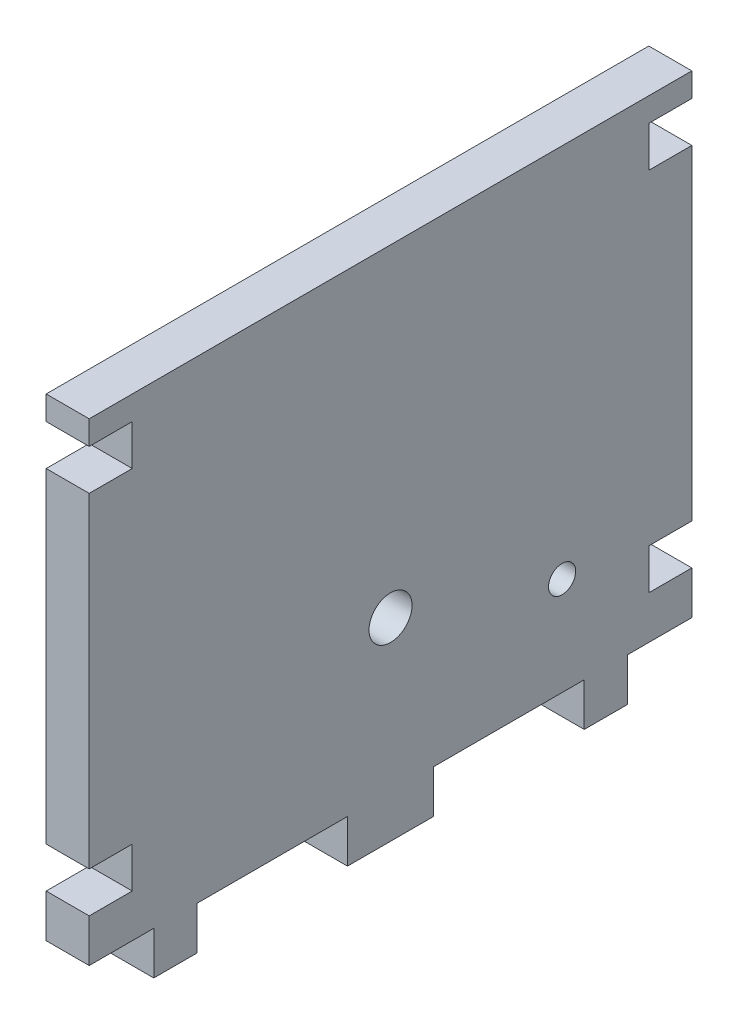
ISO-10303-21;
HEADER;
FILE_DESCRIPTION(('STEP AP214'),'2;1');
FILE_NAME('part.step','',(''),(''),'','','');
FILE_SCHEMA(('AUTOMOTIVE_DESIGN { 1 0 10303 214 1 1 1 1 }'));
ENDSEC;
DATA;
#1=APPLICATION_CONTEXT('core data for automotive mechanical design processes');
#2=APPLICATION_PROTOCOL_DEFINITION('international standard','automotive_design',2000,#1);
#3=PRODUCT_CONTEXT('',#1,'mechanical');
#4=PRODUCT('Part','Part','',(#3));
#5=PRODUCT_RELATED_PRODUCT_CATEGORY('part','',(#4));
#6=PRODUCT_DEFINITION_FORMATION('','',#4);
#7=PRODUCT_DEFINITION_CONTEXT('part definition',#1,'design');
#8=PRODUCT_DEFINITION('design','',#6,#7);
#9=PRODUCT_DEFINITION_SHAPE('','',#8);
#10=(LENGTH_UNIT() NAMED_UNIT(*) SI_UNIT(.MILLI.,.METRE.));
#11=(NAMED_UNIT(*) PLANE_ANGLE_UNIT() SI_UNIT($,.RADIAN.));
#12=(NAMED_UNIT(*) SI_UNIT($,.STERADIAN.) SOLID_ANGLE_UNIT());
#13=UNCERTAINTY_MEASURE_WITH_UNIT(LENGTH_MEASURE(1.E-05),#10,'distance_accuracy_value','');
#14=(GEOMETRIC_REPRESENTATION_CONTEXT(3) GLOBAL_UNCERTAINTY_ASSIGNED_CONTEXT((#13)) GLOBAL_UNIT_ASSIGNED_CONTEXT((#10,
#11,#12)) REPRESENTATION_CONTEXT('',''));
#15=CARTESIAN_POINT('',(0.,0.,0.));
#16=DIRECTION('',(0.,0.,1.));
#17=DIRECTION('',(1.,0.,0.));
#18=AXIS2_PLACEMENT_3D('',#15,#16,#17);
#19=CARTESIAN_POINT('',(6.35,0.,38.1));
#20=DIRECTION('',(0.,0.,-1.));
#21=DIRECTION('',(-1.,0.,0.));
#22=AXIS2_PLACEMENT_3D('',#19,#20,#21);
#23=PLANE('',#22);
#24=DIRECTION('',(0.,-1.,0.));
#25=VECTOR('',#24,1.);
#26=CARTESIAN_POINT('',(0.,0.,38.1));
#27=LINE('',#26,#25);
#28=CARTESIAN_POINT('',(0.,-9.88059999999999,38.1));
#29=VERTEX_POINT('',#28);
#30=CARTESIAN_POINT('',(0.,-15.875,38.1));
#31=VERTEX_POINT('',#30);
#32=EDGE_CURVE('E371',#29,#31,#27,.T.);
#33=ORIENTED_EDGE('',*,*,#32,.T.);
#34=DIRECTION('',(-1.,0.,0.));
#35=VECTOR('',#34,1.);
#36=CARTESIAN_POINT('',(6.35,-15.875,38.1));
#37=LINE('',#36,#35);
#38=CARTESIAN_POINT('',(6.35,-15.875,38.1));
#39=VERTEX_POINT('',#38);
#40=EDGE_CURVE('E11',#39,#31,#37,.T.);
#41=ORIENTED_EDGE('',*,*,#40,.F.);
#42=DIRECTION('',(0.,-1.,0.));
#43=VECTOR('',#42,1.);
#44=CARTESIAN_POINT('',(6.35,0.,38.1));
#45=LINE('',#44,#43);
#46=CARTESIAN_POINT('',(6.35,-9.88059999999999,38.1));
#47=VERTEX_POINT('',#46);
#48=EDGE_CURVE('E283',#47,#39,#45,.T.);
#49=ORIENTED_EDGE('',*,*,#48,.F.);
#50=DIRECTION('',(-1.,0.,0.));
#51=VECTOR('',#50,1.);
#52=CARTESIAN_POINT('',(6.35,-9.88059999999999,38.1));
#53=LINE('',#52,#51);
#54=EDGE_CURVE('E271',#47,#29,#53,.T.);
#55=ORIENTED_EDGE('',*,*,#54,.T.);
#56=EDGE_LOOP('',(#33,#41,#49,#55));
#57=FACE_BOUND('',#56,.T.);
#58=ADVANCED_FACE('F35',(#57),#23,.F.);
#59=CARTESIAN_POINT('',(6.35,-15.875,0.));
#60=DIRECTION('',(0.,-1.,0.));
#61=DIRECTION('',(0.,0.,-1.));
#62=AXIS2_PLACEMENT_3D('',#59,#60,#61);
#63=PLANE('',#62);
#64=DIRECTION('',(0.,0.,1.));
#65=VECTOR('',#64,1.);
#66=CARTESIAN_POINT('',(0.,-15.875,0.));
#67=LINE('',#66,#65);
#68=CARTESIAN_POINT('',(0.,-15.875,44.45));
#69=VERTEX_POINT('',#68);
#70=EDGE_CURVE('E365',#31,#69,#67,.T.);
#71=ORIENTED_EDGE('',*,*,#70,.T.);
#72=DIRECTION('',(-1.,0.,0.));
#73=VECTOR('',#72,1.);
#74=CARTESIAN_POINT('',(6.35,-15.875,44.45));
#75=LINE('',#74,#73);
#76=CARTESIAN_POINT('',(6.35,-15.875,44.45));
#77=VERTEX_POINT('',#76);
#78=EDGE_CURVE('E44',#77,#69,#75,.T.);
#79=ORIENTED_EDGE('',*,*,#78,.F.);
#80=DIRECTION('',(0.,0.,1.));
#81=VECTOR('',#80,1.);
#82=CARTESIAN_POINT('',(6.35,-15.875,0.));
#83=LINE('',#82,#81);
#84=EDGE_CURVE('E163',#39,#77,#83,.T.);
#85=ORIENTED_EDGE('',*,*,#84,.F.);
#86=ORIENTED_EDGE('',*,*,#40,.T.);
#87=EDGE_LOOP('',(#71,#79,#85,#86));
#88=FACE_BOUND('',#87,.T.);
#89=ADVANCED_FACE('F366',(#88),#63,.F.);
#90=CARTESIAN_POINT('',(6.35,0.,44.45));
#91=DIRECTION('',(0.,0.,1.));
#92=DIRECTION('',(1.,0.,0.));
#93=AXIS2_PLACEMENT_3D('',#90,#91,#92);
#94=PLANE('',#93);
#95=DIRECTION('',(0.,1.,0.));
#96=VECTOR('',#95,1.);
#97=CARTESIAN_POINT('',(0.,0.,44.45));
#98=LINE('',#97,#96);
#99=CARTESIAN_POINT('',(0.,-22.225,44.45));
#100=VERTEX_POINT('',#99);
#101=EDGE_CURVE('E296',#100,#69,#98,.T.);
#102=ORIENTED_EDGE('',*,*,#101,.F.);
#103=DIRECTION('',(-1.,0.,0.));
#104=VECTOR('',#103,1.);
#105=CARTESIAN_POINT('',(6.35,-22.225,44.45));
#106=LINE('',#105,#104);
#107=CARTESIAN_POINT('',(6.35,-22.225,44.45));
#108=VERTEX_POINT('',#107);
#109=EDGE_CURVE('E359',#108,#100,#106,.T.);
#110=ORIENTED_EDGE('',*,*,#109,.F.);
#111=DIRECTION('',(0.,1.,0.));
#112=VECTOR('',#111,1.);
#113=CARTESIAN_POINT('',(6.35,0.,44.45));
#114=LINE('',#113,#112);
#115=EDGE_CURVE('E270',#108,#77,#114,.T.);
#116=ORIENTED_EDGE('',*,*,#115,.T.);
#117=ORIENTED_EDGE('',*,*,#78,.T.);
#118=EDGE_LOOP('',(#102,#110,#116,#117));
#119=FACE_BOUND('',#118,.T.);
#120=ADVANCED_FACE('F362',(#119),#94,.T.);
#121=CARTESIAN_POINT('',(6.35,-22.225,0.));
#122=DIRECTION('',(0.,-1.,0.));
#123=DIRECTION('',(0.,0.,-1.));
#124=AXIS2_PLACEMENT_3D('',#121,#122,#123);
#125=PLANE('',#124);
#126=DIRECTION('',(0.,0.,1.));
#127=VECTOR('',#126,1.);
#128=CARTESIAN_POINT('',(0.,-22.225,0.));
#129=LINE('',#128,#127);
#130=CARTESIAN_POINT('',(0.,-22.225,34.925));
#131=VERTEX_POINT('',#130);
#132=EDGE_CURVE('E376',#131,#100,#129,.T.);
#133=ORIENTED_EDGE('',*,*,#132,.F.);
#134=DIRECTION('',(-1.,0.,0.));
#135=VECTOR('',#134,1.);
#136=CARTESIAN_POINT('',(6.35,-22.225,34.925));
#137=LINE('',#136,#135);
#138=CARTESIAN_POINT('',(6.35,-22.225,34.925));
#139=VERTEX_POINT('',#138);
#140=EDGE_CURVE('E357',#139,#131,#137,.T.);
#141=ORIENTED_EDGE('',*,*,#140,.F.);
#142=DIRECTION('',(0.,0.,1.));
#143=VECTOR('',#142,1.);
#144=CARTESIAN_POINT('',(6.35,-22.225,0.));
#145=LINE('',#144,#143);
#146=EDGE_CURVE('E276',#139,#108,#145,.T.);
#147=ORIENTED_EDGE('',*,*,#146,.T.);
#148=ORIENTED_EDGE('',*,*,#109,.T.);
#149=EDGE_LOOP('',(#133,#141,#147,#148));
#150=FACE_BOUND('',#149,.T.);
#151=ADVANCED_FACE('F561',(#150),#125,.T.);
#152=CARTESIAN_POINT('',(6.35,0.,34.925));
#153=DIRECTION('',(0.,0.,1.));
#154=DIRECTION('',(1.,0.,0.));
#155=AXIS2_PLACEMENT_3D('',#152,#153,#154);
#156=PLANE('',#155);
#157=DIRECTION('',(0.,1.,0.));
#158=VECTOR('',#157,1.);
#159=CARTESIAN_POINT('',(0.,0.,34.925));
#160=LINE('',#159,#158);
#161=CARTESIAN_POINT('',(0.,-28.575,34.925));
#162=VERTEX_POINT('',#161);
#163=EDGE_CURVE('E377',#162,#131,#160,.T.);
#164=ORIENTED_EDGE('',*,*,#163,.F.);
#165=DIRECTION('',(-1.,0.,0.));
#166=VECTOR('',#165,1.);
#167=CARTESIAN_POINT('',(6.35,-28.575,34.925));
#168=LINE('',#167,#166);
#169=CARTESIAN_POINT('',(6.35,-28.575,34.925));
#170=VERTEX_POINT('',#169);
#171=EDGE_CURVE('E355',#170,#162,#168,.T.);
#172=ORIENTED_EDGE('',*,*,#171,.F.);
#173=DIRECTION('',(0.,1.,0.));
#174=VECTOR('',#173,1.);
#175=CARTESIAN_POINT('',(6.35,0.,34.925));
#176=LINE('',#175,#174);
#177=EDGE_CURVE('E280',#170,#139,#176,.T.);
#178=ORIENTED_EDGE('',*,*,#177,.T.);
#179=ORIENTED_EDGE('',*,*,#140,.T.);
#180=EDGE_LOOP('',(#164,#172,#178,#179));
#181=FACE_BOUND('',#180,.T.);
#182=ADVANCED_FACE('F504',(#181),#156,.T.);
#183=CARTESIAN_POINT('',(6.35,-28.575,0.));
#184=DIRECTION('',(0.,-1.,0.));
#185=DIRECTION('',(0.,0.,-1.));
#186=AXIS2_PLACEMENT_3D('',#183,#184,#185);
#187=PLANE('',#186);
#188=DIRECTION('',(0.,0.,1.));
#189=VECTOR('',#188,1.);
#190=CARTESIAN_POINT('',(0.,-28.575,0.));
#191=LINE('',#190,#189);
#192=CARTESIAN_POINT('',(0.,-28.575,28.575));
#193=VERTEX_POINT('',#192);
#194=EDGE_CURVE('E384',#193,#162,#191,.T.);
#195=ORIENTED_EDGE('',*,*,#194,.F.);
#196=DIRECTION('',(-1.,0.,0.));
#197=VECTOR('',#196,1.);
#198=CARTESIAN_POINT('',(6.35,-28.575,28.575));
#199=LINE('',#198,#197);
#200=CARTESIAN_POINT('',(6.35,-28.575,28.575));
#201=VERTEX_POINT('',#200);
#202=EDGE_CURVE('E353',#201,#193,#199,.T.);
#203=ORIENTED_EDGE('',*,*,#202,.F.);
#204=DIRECTION('',(0.,0.,1.));
#205=VECTOR('',#204,1.);
#206=CARTESIAN_POINT('',(6.35,-28.575,0.));
#207=LINE('',#206,#205);
#208=EDGE_CURVE('E497',#201,#170,#207,.T.);
#209=ORIENTED_EDGE('',*,*,#208,.T.);
#210=ORIENTED_EDGE('',*,*,#171,.T.);
#211=EDGE_LOOP('',(#195,#203,#209,#210));
#212=FACE_BOUND('',#211,.T.);
#213=ADVANCED_FACE('F509',(#212),#187,.T.);
#214=CARTESIAN_POINT('',(6.35,0.,28.575));
#215=DIRECTION('',(0.,0.,1.));
#216=DIRECTION('',(0.,-1.,0.));
#217=AXIS2_PLACEMENT_3D('',#214,#215,#216);
#218=PLANE('',#217);
#219=DIRECTION('',(0.,1.,0.));
#220=VECTOR('',#219,1.);
#221=CARTESIAN_POINT('',(0.,0.,28.575));
#222=LINE('',#221,#220);
#223=CARTESIAN_POINT('',(0.,-22.225,28.575));
#224=VERTEX_POINT('',#223);
#225=EDGE_CURVE('E387',#193,#224,#222,.T.);
#226=ORIENTED_EDGE('',*,*,#225,.T.);
#227=DIRECTION('',(-1.,0.,0.));
#228=VECTOR('',#227,1.);
#229=CARTESIAN_POINT('',(6.35,-22.225,28.575));
#230=LINE('',#229,#228);
#231=CARTESIAN_POINT('',(6.35,-22.225,28.575));
#232=VERTEX_POINT('',#231);
#233=EDGE_CURVE('E351',#232,#224,#230,.T.);
#234=ORIENTED_EDGE('',*,*,#233,.F.);
#235=DIRECTION('',(0.,1.,0.));
#236=VECTOR('',#235,1.);
#237=CARTESIAN_POINT('',(6.35,0.,28.575));
#238=LINE('',#237,#236);
#239=EDGE_CURVE('E495',#201,#232,#238,.T.);
#240=ORIENTED_EDGE('',*,*,#239,.F.);
#241=ORIENTED_EDGE('',*,*,#202,.T.);
#242=EDGE_LOOP('',(#226,#234,#240,#241));
#243=FACE_BOUND('',#242,.T.);
#244=ADVANCED_FACE('F514',(#243),#218,.F.);
#245=CARTESIAN_POINT('',(0.,-22.225,6.34999999999999));
#246=VERTEX_POINT('',#245);
#247=EDGE_CURVE('E380',#246,#224,#129,.T.);
#248=ORIENTED_EDGE('',*,*,#247,.F.);
#249=DIRECTION('',(-1.,0.,0.));
#250=VECTOR('',#249,1.);
#251=CARTESIAN_POINT('',(6.35,-22.225,6.34999999999999));
#252=LINE('',#251,#250);
#253=CARTESIAN_POINT('',(6.35,-22.225,6.34999999999999));
#254=VERTEX_POINT('',#253);
#255=EDGE_CURVE('E349',#254,#246,#252,.T.);
#256=ORIENTED_EDGE('',*,*,#255,.F.);
#257=EDGE_CURVE('E282',#254,#232,#145,.T.);
#258=ORIENTED_EDGE('',*,*,#257,.T.);
#259=ORIENTED_EDGE('',*,*,#233,.T.);
#260=EDGE_LOOP('',(#248,#256,#258,#259));
#261=FACE_BOUND('',#260,.T.);
#262=ADVANCED_FACE('F558',(#261),#125,.T.);
#263=CARTESIAN_POINT('',(6.35,0.,6.34999999999999));
#264=DIRECTION('',(0.,0.,1.));
#265=DIRECTION('',(1.,0.,0.));
#266=AXIS2_PLACEMENT_3D('',#263,#264,#265);
#267=PLANE('',#266);
#268=DIRECTION('',(0.,1.,0.));
#269=VECTOR('',#268,1.);
#270=CARTESIAN_POINT('',(0.,0.,6.34999999999999));
#271=LINE('',#270,#269);
#272=CARTESIAN_POINT('',(0.,-28.575,6.34999999999999));
#273=VERTEX_POINT('',#272);
#274=EDGE_CURVE('E390',#273,#246,#271,.T.);
#275=ORIENTED_EDGE('',*,*,#274,.F.);
#276=DIRECTION('',(-1.,0.,0.));
#277=VECTOR('',#276,1.);
#278=CARTESIAN_POINT('',(6.35,-28.575,6.34999999999999));
#279=LINE('',#278,#277);
#280=CARTESIAN_POINT('',(6.35,-28.575,6.34999999999999));
#281=VERTEX_POINT('',#280);
#282=EDGE_CURVE('E347',#281,#273,#279,.T.);
#283=ORIENTED_EDGE('',*,*,#282,.F.);
#284=DIRECTION('',(0.,1.,0.));
#285=VECTOR('',#284,1.);
#286=CARTESIAN_POINT('',(6.35,0.,6.34999999999999));
#287=LINE('',#286,#285);
#288=EDGE_CURVE('E492',#281,#254,#287,.T.);
#289=ORIENTED_EDGE('',*,*,#288,.T.);
#290=ORIENTED_EDGE('',*,*,#255,.T.);
#291=EDGE_LOOP('',(#275,#283,#289,#290));
#292=FACE_BOUND('',#291,.T.);
#293=ADVANCED_FACE('F522',(#292),#267,.T.);
#294=CARTESIAN_POINT('',(6.35,-28.575,0.));
#295=DIRECTION('',(0.,-1.,0.));
#296=DIRECTION('',(0.,0.,-1.));
#297=AXIS2_PLACEMENT_3D('',#294,#295,#296);
#298=PLANE('',#297);
#299=DIRECTION('',(0.,0.,1.));
#300=VECTOR('',#299,1.);
#301=CARTESIAN_POINT('',(0.,-28.575,0.));
#302=LINE('',#301,#300);
#303=CARTESIAN_POINT('',(0.,-28.575,-6.35000000000001));
#304=VERTEX_POINT('',#303);
#305=EDGE_CURVE('E393',#304,#273,#302,.T.);
#306=ORIENTED_EDGE('',*,*,#305,.F.);
#307=DIRECTION('',(-1.,0.,0.));
#308=VECTOR('',#307,1.);
#309=CARTESIAN_POINT('',(6.35,-28.575,-6.35000000000001));
#310=LINE('',#309,#308);
#311=CARTESIAN_POINT('',(6.35,-28.575,-6.35000000000001));
#312=VERTEX_POINT('',#311);
#313=EDGE_CURVE('E345',#312,#304,#310,.T.);
#314=ORIENTED_EDGE('',*,*,#313,.F.);
#315=DIRECTION('',(0.,0.,1.));
#316=VECTOR('',#315,1.);
#317=CARTESIAN_POINT('',(6.35,-28.575,0.));
#318=LINE('',#317,#316);
#319=EDGE_CURVE('E489',#312,#281,#318,.T.);
#320=ORIENTED_EDGE('',*,*,#319,.T.);
#321=ORIENTED_EDGE('',*,*,#282,.T.);
#322=EDGE_LOOP('',(#306,#314,#320,#321));
#323=FACE_BOUND('',#322,.T.);
#324=ADVANCED_FACE('F526',(#323),#298,.T.);
#325=CARTESIAN_POINT('',(6.35,0.,-6.35000000000001));
#326=DIRECTION('',(0.,0.,1.));
#327=DIRECTION('',(1.,0.,0.));
#328=AXIS2_PLACEMENT_3D('',#325,#326,#327);
#329=PLANE('',#328);
#330=DIRECTION('',(0.,1.,0.));
#331=VECTOR('',#330,1.);
#332=CARTESIAN_POINT('',(0.,0.,-6.35000000000001));
#333=LINE('',#332,#331);
#334=CARTESIAN_POINT('',(0.,-22.225,-6.35000000000001));
#335=VERTEX_POINT('',#334);
#336=EDGE_CURVE('E396',#304,#335,#333,.T.);
#337=ORIENTED_EDGE('',*,*,#336,.T.);
#338=DIRECTION('',(-1.,0.,0.));
#339=VECTOR('',#338,1.);
#340=CARTESIAN_POINT('',(6.35,-22.225,-6.35000000000001));
#341=LINE('',#340,#339);
#342=CARTESIAN_POINT('',(6.35,-22.225,-6.35000000000001));
#343=VERTEX_POINT('',#342);
#344=EDGE_CURVE('E343',#343,#335,#341,.T.);
#345=ORIENTED_EDGE('',*,*,#344,.F.);
#346=DIRECTION('',(0.,1.,0.));
#347=VECTOR('',#346,1.);
#348=CARTESIAN_POINT('',(6.35,0.,-6.35000000000001));
#349=LINE('',#348,#347);
#350=EDGE_CURVE('E487',#312,#343,#349,.T.);
#351=ORIENTED_EDGE('',*,*,#350,.F.);
#352=ORIENTED_EDGE('',*,*,#313,.T.);
#353=EDGE_LOOP('',(#337,#345,#351,#352));
#354=FACE_BOUND('',#353,.T.);
#355=ADVANCED_FACE('F533',(#354),#329,.F.);
#356=CARTESIAN_POINT('',(0.,-22.225,-28.5749999999999));
#357=VERTEX_POINT('',#356);
#358=EDGE_CURVE('E399',#357,#335,#129,.T.);
#359=ORIENTED_EDGE('',*,*,#358,.F.);
#360=DIRECTION('',(-1.,0.,0.));
#361=VECTOR('',#360,1.);
#362=CARTESIAN_POINT('',(6.35,-22.225,-28.5749999999999));
#363=LINE('',#362,#361);
#364=CARTESIAN_POINT('',(6.35,-22.225,-28.5749999999999));
#365=VERTEX_POINT('',#364);
#366=EDGE_CURVE('E341',#365,#357,#363,.T.);
#367=ORIENTED_EDGE('',*,*,#366,.F.);
#368=EDGE_CURVE('E486',#365,#343,#145,.T.);
#369=ORIENTED_EDGE('',*,*,#368,.T.);
#370=ORIENTED_EDGE('',*,*,#344,.T.);
#371=EDGE_LOOP('',(#359,#367,#369,#370));
#372=FACE_BOUND('',#371,.T.);
#373=ADVANCED_FACE('F538',(#372),#125,.T.);
#374=CARTESIAN_POINT('',(6.35,0.,-28.5749999999999));
#375=DIRECTION('',(0.,0.,1.));
#376=DIRECTION('',(1.,0.,0.));
#377=AXIS2_PLACEMENT_3D('',#374,#375,#376);
#378=PLANE('',#377);
#379=DIRECTION('',(0.,1.,0.));
#380=VECTOR('',#379,1.);
#381=CARTESIAN_POINT('',(0.,0.,-28.5749999999999));
#382=LINE('',#381,#380);
#383=CARTESIAN_POINT('',(0.,-28.575,-28.5749999999999));
#384=VERTEX_POINT('',#383);
#385=EDGE_CURVE('E400',#384,#357,#382,.T.);
#386=ORIENTED_EDGE('',*,*,#385,.F.);
#387=DIRECTION('',(-1.,0.,0.));
#388=VECTOR('',#387,1.);
#389=CARTESIAN_POINT('',(6.35,-28.575,-28.5749999999999));
#390=LINE('',#389,#388);
#391=CARTESIAN_POINT('',(6.35,-28.575,-28.5749999999999));
#392=VERTEX_POINT('',#391);
#393=EDGE_CURVE('E339',#392,#384,#390,.T.);
#394=ORIENTED_EDGE('',*,*,#393,.F.);
#395=DIRECTION('',(0.,1.,0.));
#396=VECTOR('',#395,1.);
#397=CARTESIAN_POINT('',(6.35,0.,-28.5749999999999));
#398=LINE('',#397,#396);
#399=EDGE_CURVE('E483',#392,#365,#398,.T.);
#400=ORIENTED_EDGE('',*,*,#399,.T.);
#401=ORIENTED_EDGE('',*,*,#366,.T.);
#402=EDGE_LOOP('',(#386,#394,#400,#401));
#403=FACE_BOUND('',#402,.T.);
#404=ADVANCED_FACE('F571',(#403),#378,.T.);
#405=CARTESIAN_POINT('',(6.35,-28.575,0.));
#406=DIRECTION('',(0.,1.,0.));
#407=DIRECTION('',(0.,0.,1.));
#408=AXIS2_PLACEMENT_3D('',#405,#406,#407);
#409=PLANE('',#408);
#410=DIRECTION('',(0.,0.,-1.));
#411=VECTOR('',#410,1.);
#412=CARTESIAN_POINT('',(0.,-28.575,0.));
#413=LINE('',#412,#411);
#414=CARTESIAN_POINT('',(0.,-28.575,-34.925));
#415=VERTEX_POINT('',#414);
#416=EDGE_CURVE('E403',#384,#415,#413,.T.);
#417=ORIENTED_EDGE('',*,*,#416,.T.);
#418=DIRECTION('',(-1.,0.,0.));
#419=VECTOR('',#418,1.);
#420=CARTESIAN_POINT('',(6.35,-28.575,-34.925));
#421=LINE('',#420,#419);
#422=CARTESIAN_POINT('',(6.35,-28.575,-34.925));
#423=VERTEX_POINT('',#422);
#424=EDGE_CURVE('E336',#423,#415,#421,.T.);
#425=ORIENTED_EDGE('',*,*,#424,.F.);
#426=DIRECTION('',(0.,0.,-1.));
#427=VECTOR('',#426,1.);
#428=CARTESIAN_POINT('',(6.35,-28.575,0.));
#429=LINE('',#428,#427);
#430=EDGE_CURVE('E481',#392,#423,#429,.T.);
#431=ORIENTED_EDGE('',*,*,#430,.F.);
#432=ORIENTED_EDGE('',*,*,#393,.T.);
#433=EDGE_LOOP('',(#417,#425,#431,#432));
#434=FACE_BOUND('',#433,.T.);
#435=ADVANCED_FACE('F689',(#434),#409,.F.);
#436=CARTESIAN_POINT('',(6.35,0.,-34.925));
#437=DIRECTION('',(0.,0.,1.));
#438=DIRECTION('',(1.,0.,0.));
#439=AXIS2_PLACEMENT_3D('',#436,#437,#438);
#440=PLANE('',#439);
#441=DIRECTION('',(0.,1.,0.));
#442=VECTOR('',#441,1.);
#443=CARTESIAN_POINT('',(0.,0.,-34.925));
#444=LINE('',#443,#442);
#445=CARTESIAN_POINT('',(0.,-22.225,-34.925));
#446=VERTEX_POINT('',#445);
#447=EDGE_CURVE('E405',#415,#446,#444,.T.);
#448=ORIENTED_EDGE('',*,*,#447,.T.);
#449=DIRECTION('',(-1.,0.,0.));
#450=VECTOR('',#449,1.);
#451=CARTESIAN_POINT('',(6.35,-22.225,-34.925));
#452=LINE('',#451,#450);
#453=CARTESIAN_POINT('',(6.35,-22.225,-34.925));
#454=VERTEX_POINT('',#453);
#455=EDGE_CURVE('E334',#454,#446,#452,.T.);
#456=ORIENTED_EDGE('',*,*,#455,.F.);
#457=DIRECTION('',(0.,1.,0.));
#458=VECTOR('',#457,1.);
#459=CARTESIAN_POINT('',(6.35,0.,-34.925));
#460=LINE('',#459,#458);
#461=EDGE_CURVE('E479',#423,#454,#460,.T.);
#462=ORIENTED_EDGE('',*,*,#461,.F.);
#463=ORIENTED_EDGE('',*,*,#424,.T.);
#464=EDGE_LOOP('',(#448,#456,#462,#463));
#465=FACE_BOUND('',#464,.T.);
#466=ADVANCED_FACE('F552',(#465),#440,.F.);
#467=CARTESIAN_POINT('',(0.,-22.225,-44.45));
#468=VERTEX_POINT('',#467);
#469=EDGE_CURVE('E379',#468,#446,#129,.T.);
#470=ORIENTED_EDGE('',*,*,#469,.F.);
#471=DIRECTION('',(-1.,0.,0.));
#472=VECTOR('',#471,1.);
#473=CARTESIAN_POINT('',(6.35,-22.225,-44.45));
#474=LINE('',#473,#472);
#475=CARTESIAN_POINT('',(6.35,-22.225,-44.45));
#476=VERTEX_POINT('',#475);
#477=EDGE_CURVE('E332',#476,#468,#474,.T.);
#478=ORIENTED_EDGE('',*,*,#477,.F.);
#479=EDGE_CURVE('E281',#476,#454,#145,.T.);
#480=ORIENTED_EDGE('',*,*,#479,.T.);
#481=ORIENTED_EDGE('',*,*,#455,.T.);
#482=EDGE_LOOP('',(#470,#478,#480,#481));
#483=FACE_BOUND('',#482,.T.);
#484=ADVANCED_FACE('F543',(#483),#125,.T.);
#485=CARTESIAN_POINT('',(6.35,0.,-44.45));
#486=DIRECTION('',(0.,0.,1.));
#487=DIRECTION('',(1.,0.,0.));
#488=AXIS2_PLACEMENT_3D('',#485,#486,#487);
#489=PLANE('',#488);
#490=DIRECTION('',(0.,1.,0.));
#491=VECTOR('',#490,1.);
#492=CARTESIAN_POINT('',(0.,0.,-44.45));
#493=LINE('',#492,#491);
#494=CARTESIAN_POINT('',(0.,-15.875,-44.45));
#495=VERTEX_POINT('',#494);
#496=EDGE_CURVE('E408',#468,#495,#493,.T.);
#497=ORIENTED_EDGE('',*,*,#496,.T.);
#498=DIRECTION('',(-1.,0.,0.));
#499=VECTOR('',#498,1.);
#500=CARTESIAN_POINT('',(6.35,-15.875,-44.45));
#501=LINE('',#500,#499);
#502=CARTESIAN_POINT('',(6.35,-15.875,-44.45));
#503=VERTEX_POINT('',#502);
#504=EDGE_CURVE('E330',#503,#495,#501,.T.);
#505=ORIENTED_EDGE('',*,*,#504,.F.);
#506=DIRECTION('',(0.,1.,0.));
#507=VECTOR('',#506,1.);
#508=CARTESIAN_POINT('',(6.35,0.,-44.45));
#509=LINE('',#508,#507);
#510=EDGE_CURVE('E477',#476,#503,#509,.T.);
#511=ORIENTED_EDGE('',*,*,#510,.F.);
#512=ORIENTED_EDGE('',*,*,#477,.T.);
#513=EDGE_LOOP('',(#497,#505,#511,#512));
#514=FACE_BOUND('',#513,.T.);
#515=ADVANCED_FACE('F643',(#514),#489,.F.);
#516=CARTESIAN_POINT('',(6.35,-15.8750000000001,0.));
#517=DIRECTION('',(0.,1.,0.));
#518=DIRECTION('',(0.,0.,1.));
#519=AXIS2_PLACEMENT_3D('',#516,#517,#518);
#520=PLANE('',#519);
#521=DIRECTION('',(0.,0.,-1.));
#522=VECTOR('',#521,1.);
#523=CARTESIAN_POINT('',(0.,-15.8750000000001,0.));
#524=LINE('',#523,#522);
#525=CARTESIAN_POINT('',(0.,-15.875,-38.1));
#526=VERTEX_POINT('',#525);
#527=EDGE_CURVE('E411',#526,#495,#524,.T.);
#528=ORIENTED_EDGE('',*,*,#527,.F.);
#529=DIRECTION('',(-1.,0.,0.));
#530=VECTOR('',#529,1.);
#531=CARTESIAN_POINT('',(6.35,-15.875,-38.1));
#532=LINE('',#531,#530);
#533=CARTESIAN_POINT('',(6.35,-15.875,-38.1));
#534=VERTEX_POINT('',#533);
#535=EDGE_CURVE('E328',#534,#526,#532,.T.);
#536=ORIENTED_EDGE('',*,*,#535,.F.);
#537=DIRECTION('',(0.,0.,-1.));
#538=VECTOR('',#537,1.);
#539=CARTESIAN_POINT('',(6.35,-15.8750000000001,0.));
#540=LINE('',#539,#538);
#541=EDGE_CURVE('E474',#534,#503,#540,.T.);
#542=ORIENTED_EDGE('',*,*,#541,.T.);
#543=ORIENTED_EDGE('',*,*,#504,.T.);
#544=EDGE_LOOP('',(#528,#536,#542,#543));
#545=FACE_BOUND('',#544,.T.);
#546=ADVANCED_FACE('F649',(#545),#520,.T.);
#547=CARTESIAN_POINT('',(6.35,0.,-38.1));
#548=DIRECTION('',(0.,0.,1.));
#549=DIRECTION('',(1.,0.,0.));
#550=AXIS2_PLACEMENT_3D('',#547,#548,#549);
#551=PLANE('',#550);
#552=DIRECTION('',(0.,1.,0.));
#553=VECTOR('',#552,1.);
#554=CARTESIAN_POINT('',(0.,0.,-38.1));
#555=LINE('',#554,#553);
#556=CARTESIAN_POINT('',(0.,-9.88059999999999,-38.1));
#557=VERTEX_POINT('',#556);
#558=EDGE_CURVE('E415',#526,#557,#555,.T.);
#559=ORIENTED_EDGE('',*,*,#558,.T.);
#560=DIRECTION('',(-1.,0.,0.));
#561=VECTOR('',#560,1.);
#562=CARTESIAN_POINT('',(6.35,-9.88059999999999,-38.1));
#563=LINE('',#562,#561);
#564=CARTESIAN_POINT('',(6.35,-9.88059999999999,-38.1));
#565=VERTEX_POINT('',#564);
#566=EDGE_CURVE('E325',#565,#557,#563,.T.);
#567=ORIENTED_EDGE('',*,*,#566,.F.);
#568=DIRECTION('',(0.,1.,0.));
#569=VECTOR('',#568,1.);
#570=CARTESIAN_POINT('',(6.35,0.,-38.1));
#571=LINE('',#570,#569);
#572=EDGE_CURVE('E472',#534,#565,#571,.T.);
#573=ORIENTED_EDGE('',*,*,#572,.F.);
#574=ORIENTED_EDGE('',*,*,#535,.T.);
#575=EDGE_LOOP('',(#559,#567,#573,#574));
#576=FACE_BOUND('',#575,.T.);
#577=ADVANCED_FACE('F646',(#576),#551,.F.);
#578=CARTESIAN_POINT('',(6.35,-9.88059999999999,0.));
#579=DIRECTION('',(0.,1.,0.));
#580=DIRECTION('',(0.,0.,1.));
#581=AXIS2_PLACEMENT_3D('',#578,#579,#580);
#582=PLANE('',#581);
#583=DIRECTION('',(0.,0.,-1.));
#584=VECTOR('',#583,1.);
#585=CARTESIAN_POINT('',(0.,-9.88059999999999,0.));
#586=LINE('',#585,#584);
#587=CARTESIAN_POINT('',(0.,-9.88059999999999,-44.45));
#588=VERTEX_POINT('',#587);
#589=EDGE_CURVE('E417',#557,#588,#586,.T.);
#590=ORIENTED_EDGE('',*,*,#589,.T.);
#591=DIRECTION('',(-1.,0.,0.));
#592=VECTOR('',#591,1.);
#593=CARTESIAN_POINT('',(6.35,-9.88059999999999,-44.45));
#594=LINE('',#593,#592);
#595=CARTESIAN_POINT('',(6.35,-9.88059999999999,-44.45));
#596=VERTEX_POINT('',#595);
#597=EDGE_CURVE('E322',#596,#588,#594,.T.);
#598=ORIENTED_EDGE('',*,*,#597,.F.);
#599=DIRECTION('',(0.,0.,-1.));
#600=VECTOR('',#599,1.);
#601=CARTESIAN_POINT('',(6.35,-9.88059999999999,0.));
#602=LINE('',#601,#600);
#603=EDGE_CURVE('E470',#565,#596,#602,.T.);
#604=ORIENTED_EDGE('',*,*,#603,.F.);
#605=ORIENTED_EDGE('',*,*,#566,.T.);
#606=EDGE_LOOP('',(#590,#598,#604,#605));
#607=FACE_BOUND('',#606,.T.);
#608=ADVANCED_FACE('F641',(#607),#582,.F.);
#609=CARTESIAN_POINT('',(0.,38.1,-44.45));
#610=VERTEX_POINT('',#609);
#611=EDGE_CURVE('E412',#588,#610,#493,.T.);
#612=ORIENTED_EDGE('',*,*,#611,.T.);
#613=DIRECTION('',(-1.,0.,0.));
#614=VECTOR('',#613,1.);
#615=CARTESIAN_POINT('',(6.35,38.1,-44.45));
#616=LINE('',#615,#614);
#617=CARTESIAN_POINT('',(6.35,38.1,-44.45));
#618=VERTEX_POINT('',#617);
#619=EDGE_CURVE('E319',#618,#610,#616,.T.);
#620=ORIENTED_EDGE('',*,*,#619,.F.);
#621=EDGE_CURVE('E469',#596,#618,#509,.T.);
#622=ORIENTED_EDGE('',*,*,#621,.F.);
#623=ORIENTED_EDGE('',*,*,#597,.T.);
#624=EDGE_LOOP('',(#612,#620,#622,#623));
#625=FACE_BOUND('',#624,.T.);
#626=ADVANCED_FACE('F637',(#625),#489,.F.);
#627=CARTESIAN_POINT('',(6.35,38.0999999999999,0.));
#628=DIRECTION('',(0.,-1.,0.));
#629=DIRECTION('',(0.,0.,-1.));
#630=AXIS2_PLACEMENT_3D('',#627,#628,#629);
#631=PLANE('',#630);
#632=DIRECTION('',(0.,0.,1.));
#633=VECTOR('',#632,1.);
#634=CARTESIAN_POINT('',(0.,38.0999999999999,0.));
#635=LINE('',#634,#633);
#636=CARTESIAN_POINT('',(0.,38.1,-38.1));
#637=VERTEX_POINT('',#636);
#638=EDGE_CURVE('E419',#610,#637,#635,.T.);
#639=ORIENTED_EDGE('',*,*,#638,.T.);
#640=DIRECTION('',(-1.,0.,0.));
#641=VECTOR('',#640,1.);
#642=CARTESIAN_POINT('',(6.35,38.1,-38.1));
#643=LINE('',#642,#641);
#644=CARTESIAN_POINT('',(6.35,38.1,-38.1));
#645=VERTEX_POINT('',#644);
#646=EDGE_CURVE('E317',#645,#637,#643,.T.);
#647=ORIENTED_EDGE('',*,*,#646,.F.);
#648=DIRECTION('',(0.,0.,1.));
#649=VECTOR('',#648,1.);
#650=CARTESIAN_POINT('',(6.35,38.0999999999999,0.));
#651=LINE('',#650,#649);
#652=EDGE_CURVE('E467',#618,#645,#651,.T.);
#653=ORIENTED_EDGE('',*,*,#652,.F.);
#654=ORIENTED_EDGE('',*,*,#619,.T.);
#655=EDGE_LOOP('',(#639,#647,#653,#654));
#656=FACE_BOUND('',#655,.T.);
#657=ADVANCED_FACE('F633',(#656),#631,.F.);
#658=CARTESIAN_POINT('',(6.35,0.,-38.1));
#659=DIRECTION('',(0.,0.,-1.));
#660=DIRECTION('',(-1.,0.,0.));
#661=AXIS2_PLACEMENT_3D('',#658,#659,#660);
#662=PLANE('',#661);
#663=DIRECTION('',(0.,-1.,0.));
#664=VECTOR('',#663,1.);
#665=CARTESIAN_POINT('',(0.,0.,-38.1));
#666=LINE('',#665,#664);
#667=CARTESIAN_POINT('',(0.,44.0944,-38.1));
#668=VERTEX_POINT('',#667);
#669=EDGE_CURVE('E422',#668,#637,#666,.T.);
#670=ORIENTED_EDGE('',*,*,#669,.F.);
#671=DIRECTION('',(-1.,0.,0.));
#672=VECTOR('',#671,1.);
#673=CARTESIAN_POINT('',(6.35,44.0944,-38.1));
#674=LINE('',#673,#672);
#675=CARTESIAN_POINT('',(6.35,44.0944,-38.1));
#676=VERTEX_POINT('',#675);
#677=EDGE_CURVE('E315',#676,#668,#674,.T.);
#678=ORIENTED_EDGE('',*,*,#677,.F.);
#679=DIRECTION('',(0.,-1.,0.));
#680=VECTOR('',#679,1.);
#681=CARTESIAN_POINT('',(6.35,0.,-38.1));
#682=LINE('',#681,#680);
#683=EDGE_CURVE('E464',#676,#645,#682,.T.);
#684=ORIENTED_EDGE('',*,*,#683,.T.);
#685=ORIENTED_EDGE('',*,*,#646,.T.);
#686=EDGE_LOOP('',(#670,#678,#684,#685));
#687=FACE_BOUND('',#686,.T.);
#688=ADVANCED_FACE('F629',(#687),#662,.T.);
#689=CARTESIAN_POINT('',(6.35,44.0944,0.));
#690=DIRECTION('',(0.,-1.,0.));
#691=DIRECTION('',(0.,0.,-1.));
#692=AXIS2_PLACEMENT_3D('',#689,#690,#691);
#693=PLANE('',#692);
#694=DIRECTION('',(0.,0.,1.));
#695=VECTOR('',#694,1.);
#696=CARTESIAN_POINT('',(0.,44.0944,0.));
#697=LINE('',#696,#695);
#698=CARTESIAN_POINT('',(0.,44.0944,-44.45));
#699=VERTEX_POINT('',#698);
#700=EDGE_CURVE('E425',#699,#668,#697,.T.);
#701=ORIENTED_EDGE('',*,*,#700,.F.);
#702=DIRECTION('',(-1.,0.,0.));
#703=VECTOR('',#702,1.);
#704=CARTESIAN_POINT('',(6.35,44.0944,-44.45));
#705=LINE('',#704,#703);
#706=CARTESIAN_POINT('',(6.35,44.0944,-44.45));
#707=VERTEX_POINT('',#706);
#708=EDGE_CURVE('E313',#707,#699,#705,.T.);
#709=ORIENTED_EDGE('',*,*,#708,.F.);
#710=DIRECTION('',(0.,0.,1.));
#711=VECTOR('',#710,1.);
#712=CARTESIAN_POINT('',(6.35,44.0944,0.));
#713=LINE('',#712,#711);
#714=EDGE_CURVE('E461',#707,#676,#713,.T.);
#715=ORIENTED_EDGE('',*,*,#714,.T.);
#716=ORIENTED_EDGE('',*,*,#677,.T.);
#717=EDGE_LOOP('',(#701,#709,#715,#716));
#718=FACE_BOUND('',#717,.T.);
#719=ADVANCED_FACE('F625',(#718),#693,.T.);
#720=CARTESIAN_POINT('',(6.35,0.,-44.45));
#721=DIRECTION('',(0.,0.,-1.));
#722=DIRECTION('',(0.,1.,0.));
#723=AXIS2_PLACEMENT_3D('',#720,#721,#722);
#724=PLANE('',#723);
#725=DIRECTION('',(0.,-1.,0.));
#726=VECTOR('',#725,1.);
#727=CARTESIAN_POINT('',(0.,0.,-44.45));
#728=LINE('',#727,#726);
#729=CARTESIAN_POINT('',(0.,47.625,-44.45));
#730=VERTEX_POINT('',#729);
#731=EDGE_CURVE('E428',#730,#699,#728,.T.);
#732=ORIENTED_EDGE('',*,*,#731,.F.);
#733=DIRECTION('',(-1.,0.,0.));
#734=VECTOR('',#733,1.);
#735=CARTESIAN_POINT('',(6.35,47.625,-44.45));
#736=LINE('',#735,#734);
#737=CARTESIAN_POINT('',(6.35,47.625,-44.45));
#738=VERTEX_POINT('',#737);
#739=EDGE_CURVE('E311',#738,#730,#736,.T.);
#740=ORIENTED_EDGE('',*,*,#739,.F.);
#741=DIRECTION('',(0.,-1.,0.));
#742=VECTOR('',#741,1.);
#743=CARTESIAN_POINT('',(6.35,0.,-44.45));
#744=LINE('',#743,#742);
#745=EDGE_CURVE('E458',#738,#707,#744,.T.);
#746=ORIENTED_EDGE('',*,*,#745,.T.);
#747=ORIENTED_EDGE('',*,*,#708,.T.);
#748=EDGE_LOOP('',(#732,#740,#746,#747));
#749=FACE_BOUND('',#748,.T.);
#750=ADVANCED_FACE('F621',(#749),#724,.T.);
#751=CARTESIAN_POINT('',(6.35,47.625,0.));
#752=DIRECTION('',(0.,1.,0.));
#753=DIRECTION('',(0.,0.,1.));
#754=AXIS2_PLACEMENT_3D('',#751,#752,#753);
#755=PLANE('',#754);
#756=DIRECTION('',(0.,0.,-1.));
#757=VECTOR('',#756,1.);
#758=CARTESIAN_POINT('',(0.,47.625,0.));
#759=LINE('',#758,#757);
#760=CARTESIAN_POINT('',(0.,47.625,44.45));
#761=VERTEX_POINT('',#760);
#762=EDGE_CURVE('E431',#761,#730,#759,.T.);
#763=ORIENTED_EDGE('',*,*,#762,.F.);
#764=DIRECTION('',(-1.,0.,0.));
#765=VECTOR('',#764,1.);
#766=CARTESIAN_POINT('',(6.35,47.625,44.45));
#767=LINE('',#766,#765);
#768=CARTESIAN_POINT('',(6.35,47.625,44.45));
#769=VERTEX_POINT('',#768);
#770=EDGE_CURVE('E309',#769,#761,#767,.T.);
#771=ORIENTED_EDGE('',*,*,#770,.F.);
#772=DIRECTION('',(0.,0.,-1.));
#773=VECTOR('',#772,1.);
#774=CARTESIAN_POINT('',(6.35,47.625,0.));
#775=LINE('',#774,#773);
#776=EDGE_CURVE('E455',#769,#738,#775,.T.);
#777=ORIENTED_EDGE('',*,*,#776,.T.);
#778=ORIENTED_EDGE('',*,*,#739,.T.);
#779=EDGE_LOOP('',(#763,#771,#777,#778));
#780=FACE_BOUND('',#779,.T.);
#781=ADVANCED_FACE('F617',(#780),#755,.T.);
#782=CARTESIAN_POINT('',(6.35,0.,44.45));
#783=DIRECTION('',(0.,0.,-1.));
#784=DIRECTION('',(-1.,0.,0.));
#785=AXIS2_PLACEMENT_3D('',#782,#783,#784);
#786=PLANE('',#785);
#787=DIRECTION('',(0.,-1.,0.));
#788=VECTOR('',#787,1.);
#789=CARTESIAN_POINT('',(0.,0.,44.45));
#790=LINE('',#789,#788);
#791=CARTESIAN_POINT('',(0.,44.0944,44.45));
#792=VERTEX_POINT('',#791);
#793=EDGE_CURVE('E434',#761,#792,#790,.T.);
#794=ORIENTED_EDGE('',*,*,#793,.T.);
#795=DIRECTION('',(-1.,0.,0.));
#796=VECTOR('',#795,1.);
#797=CARTESIAN_POINT('',(6.35,44.0944,44.45));
#798=LINE('',#797,#796);
#799=CARTESIAN_POINT('',(6.35,44.0944,44.45));
#800=VERTEX_POINT('',#799);
#801=EDGE_CURVE('E306',#800,#792,#798,.T.);
#802=ORIENTED_EDGE('',*,*,#801,.F.);
#803=DIRECTION('',(0.,-1.,0.));
#804=VECTOR('',#803,1.);
#805=CARTESIAN_POINT('',(6.35,0.,44.45));
#806=LINE('',#805,#804);
#807=EDGE_CURVE('E453',#769,#800,#806,.T.);
#808=ORIENTED_EDGE('',*,*,#807,.F.);
#809=ORIENTED_EDGE('',*,*,#770,.T.);
#810=EDGE_LOOP('',(#794,#802,#808,#809));
#811=FACE_BOUND('',#810,.T.);
#812=ADVANCED_FACE('F613',(#811),#786,.F.);
#813=CARTESIAN_POINT('',(6.35,44.0944,0.));
#814=DIRECTION('',(0.,1.,0.));
#815=DIRECTION('',(0.,0.,1.));
#816=AXIS2_PLACEMENT_3D('',#813,#814,#815);
#817=PLANE('',#816);
#818=DIRECTION('',(0.,0.,-1.));
#819=VECTOR('',#818,1.);
#820=CARTESIAN_POINT('',(0.,44.0944,0.));
#821=LINE('',#820,#819);
#822=CARTESIAN_POINT('',(0.,44.0944,38.1));
#823=VERTEX_POINT('',#822);
#824=EDGE_CURVE('E436',#792,#823,#821,.T.);
#825=ORIENTED_EDGE('',*,*,#824,.T.);
#826=DIRECTION('',(-1.,0.,0.));
#827=VECTOR('',#826,1.);
#828=CARTESIAN_POINT('',(6.35,44.0944,38.1));
#829=LINE('',#828,#827);
#830=CARTESIAN_POINT('',(6.35,44.0944,38.1));
#831=VERTEX_POINT('',#830);
#832=EDGE_CURVE('E303',#831,#823,#829,.T.);
#833=ORIENTED_EDGE('',*,*,#832,.F.);
#834=DIRECTION('',(0.,0.,-1.));
#835=VECTOR('',#834,1.);
#836=CARTESIAN_POINT('',(6.35,44.0944,0.));
#837=LINE('',#836,#835);
#838=EDGE_CURVE('E451',#800,#831,#837,.T.);
#839=ORIENTED_EDGE('',*,*,#838,.F.);
#840=ORIENTED_EDGE('',*,*,#801,.T.);
#841=EDGE_LOOP('',(#825,#833,#839,#840));
#842=FACE_BOUND('',#841,.T.);
#843=ADVANCED_FACE('F610',(#842),#817,.F.);
#844=CARTESIAN_POINT('',(6.35,0.,38.1));
#845=DIRECTION('',(0.,0.,-1.));
#846=DIRECTION('',(-1.,0.,0.));
#847=AXIS2_PLACEMENT_3D('',#844,#845,#846);
#848=PLANE('',#847);
#849=DIRECTION('',(0.,-1.,0.));
#850=VECTOR('',#849,1.);
#851=CARTESIAN_POINT('',(0.,0.,38.1));
#852=LINE('',#851,#850);
#853=CARTESIAN_POINT('',(0.,38.1,38.1));
#854=VERTEX_POINT('',#853);
#855=EDGE_CURVE('E437',#823,#854,#852,.T.);
#856=ORIENTED_EDGE('',*,*,#855,.T.);
#857=DIRECTION('',(-1.,0.,0.));
#858=VECTOR('',#857,1.);
#859=CARTESIAN_POINT('',(6.35,38.1,38.1));
#860=LINE('',#859,#858);
#861=CARTESIAN_POINT('',(6.35,38.1,38.1));
#862=VERTEX_POINT('',#861);
#863=EDGE_CURVE('E260',#862,#854,#860,.T.);
#864=ORIENTED_EDGE('',*,*,#863,.F.);
#865=DIRECTION('',(0.,-1.,0.));
#866=VECTOR('',#865,1.);
#867=CARTESIAN_POINT('',(6.35,0.,38.1));
#868=LINE('',#867,#866);
#869=EDGE_CURVE('E265',#831,#862,#868,.T.);
#870=ORIENTED_EDGE('',*,*,#869,.F.);
#871=ORIENTED_EDGE('',*,*,#832,.T.);
#872=EDGE_LOOP('',(#856,#864,#870,#871));
#873=FACE_BOUND('',#872,.T.);
#874=ADVANCED_FACE('F607',(#873),#848,.F.);
#875=CARTESIAN_POINT('',(6.35,38.1,0.));
#876=DIRECTION('',(0.,1.,0.));
#877=DIRECTION('',(0.,0.,1.));
#878=AXIS2_PLACEMENT_3D('',#875,#876,#877);
#879=PLANE('',#878);
#880=DIRECTION('',(0.,0.,-1.));
#881=VECTOR('',#880,1.);
#882=CARTESIAN_POINT('',(0.,38.1,0.));
#883=LINE('',#882,#881);
#884=CARTESIAN_POINT('',(0.,38.1,44.45));
#885=VERTEX_POINT('',#884);
#886=EDGE_CURVE('E255',#885,#854,#883,.T.);
#887=ORIENTED_EDGE('',*,*,#886,.F.);
#888=DIRECTION('',(-1.,0.,0.));
#889=VECTOR('',#888,1.);
#890=CARTESIAN_POINT('',(6.35,38.1,44.45));
#891=LINE('',#890,#889);
#892=CARTESIAN_POINT('',(6.35,38.1,44.45));
#893=VERTEX_POINT('',#892);
#894=EDGE_CURVE('E250',#893,#885,#891,.T.);
#895=ORIENTED_EDGE('',*,*,#894,.F.);
#896=DIRECTION('',(0.,0.,-1.));
#897=VECTOR('',#896,1.);
#898=CARTESIAN_POINT('',(6.35,38.1,0.));
#899=LINE('',#898,#897);
#900=EDGE_CURVE('E253',#893,#862,#899,.T.);
#901=ORIENTED_EDGE('',*,*,#900,.T.);
#902=ORIENTED_EDGE('',*,*,#863,.T.);
#903=EDGE_LOOP('',(#887,#895,#901,#902));
#904=FACE_BOUND('',#903,.T.);
#905=ADVANCED_FACE('F252',(#904),#879,.T.);
#906=CARTESIAN_POINT('',(0.,-9.88059999999999,44.45));
#907=VERTEX_POINT('',#906);
#908=EDGE_CURVE('E293',#907,#885,#98,.T.);
#909=ORIENTED_EDGE('',*,*,#908,.F.);
#910=DIRECTION('',(-1.,0.,0.));
#911=VECTOR('',#910,1.);
#912=CARTESIAN_POINT('',(6.35,-9.88059999999999,44.45));
#913=LINE('',#912,#911);
#914=CARTESIAN_POINT('',(6.35,-9.88059999999999,44.45));
#915=VERTEX_POINT('',#914);
#916=EDGE_CURVE('E152',#915,#907,#913,.T.);
#917=ORIENTED_EDGE('',*,*,#916,.F.);
#918=EDGE_CURVE('E263',#915,#893,#114,.T.);
#919=ORIENTED_EDGE('',*,*,#918,.T.);
#920=ORIENTED_EDGE('',*,*,#894,.T.);
#921=EDGE_LOOP('',(#909,#917,#919,#920));
#922=FACE_BOUND('',#921,.T.);
#923=ADVANCED_FACE('F268',(#922),#94,.T.);
#924=CARTESIAN_POINT('',(6.35,0.,0.));
#925=DIRECTION('',(-1.,0.,0.));
#926=DIRECTION('',(0.,0.,1.));
#927=AXIS2_PLACEMENT_3D('',#924,#925,#926);
#928=CYLINDRICAL_SURFACE('',#927,3.175);
#929=CARTESIAN_POINT('',(6.35,0.,0.));
#930=DIRECTION('',(1.,0.,0.));
#931=DIRECTION('',(0.,0.,-1.));
#932=AXIS2_PLACEMENT_3D('',#929,#930,#931);
#933=CIRCLE('',#932,3.175);
#934=CARTESIAN_POINT('',(6.35,0.,-3.175));
#935=VERTEX_POINT('',#934);
#936=EDGE_CURVE('E284',#935,#935,#933,.T.);
#937=ORIENTED_EDGE('',*,*,#936,.T.);
#938=EDGE_LOOP('',(#937));
#939=FACE_BOUND('',#938,.T.);
#940=CARTESIAN_POINT('',(0.,0.,0.));
#941=DIRECTION('',(1.,0.,0.));
#942=DIRECTION('',(0.,0.,-1.));
#943=AXIS2_PLACEMENT_3D('',#940,#941,#942);
#944=CIRCLE('',#943,3.175);
#945=CARTESIAN_POINT('',(0.,0.,-3.175));
#946=VERTEX_POINT('',#945);
#947=EDGE_CURVE('E443',#946,#946,#944,.T.);
#948=ORIENTED_EDGE('',*,*,#947,.F.);
#949=EDGE_LOOP('',(#948));
#950=FACE_BOUND('',#949,.T.);
#951=ADVANCED_FACE('F581',(#939,#950),#928,.F.);
#952=CARTESIAN_POINT('',(6.35,-7.724902,-25.309068));
#953=DIRECTION('',(-1.,0.,0.));
#954=DIRECTION('',(0.,0.,1.));
#955=AXIS2_PLACEMENT_3D('',#952,#953,#954);
#956=CYLINDRICAL_SURFACE('',#955,2.);
#957=CARTESIAN_POINT('',(6.35,-7.724902,-25.309068));
#958=DIRECTION('',(1.,0.,0.));
#959=DIRECTION('',(0.,0.,-1.));
#960=AXIS2_PLACEMENT_3D('',#957,#958,#959);
#961=CIRCLE('',#960,2.);
#962=CARTESIAN_POINT('',(6.35,-7.724902,-27.309068));
#963=VERTEX_POINT('',#962);
#964=EDGE_CURVE('E289',#963,#963,#961,.T.);
#965=ORIENTED_EDGE('',*,*,#964,.T.);
#966=EDGE_LOOP('',(#965));
#967=FACE_BOUND('',#966,.T.);
#968=CARTESIAN_POINT('',(0.,-7.724902,-25.309068));
#969=DIRECTION('',(1.,0.,0.));
#970=DIRECTION('',(0.,0.,-1.));
#971=AXIS2_PLACEMENT_3D('',#968,#969,#970);
#972=CIRCLE('',#971,2.);
#973=CARTESIAN_POINT('',(0.,-7.724902,-27.309068));
#974=VERTEX_POINT('',#973);
#975=EDGE_CURVE('E445',#974,#974,#972,.T.);
#976=ORIENTED_EDGE('',*,*,#975,.F.);
#977=EDGE_LOOP('',(#976));
#978=FACE_BOUND('',#977,.T.);
#979=ADVANCED_FACE('F37',(#967,#978),#956,.F.);
#980=CARTESIAN_POINT('',(6.35,-9.88059999999999,0.));
#981=DIRECTION('',(0.,1.,0.));
#982=DIRECTION('',(0.,0.,1.));
#983=AXIS2_PLACEMENT_3D('',#980,#981,#982);
#984=PLANE('',#983);
#985=DIRECTION('',(0.,0.,-1.));
#986=VECTOR('',#985,1.);
#987=CARTESIAN_POINT('',(0.,-9.88059999999999,0.));
#988=LINE('',#987,#986);
#989=EDGE_CURVE('E155',#907,#29,#988,.T.);
#990=ORIENTED_EDGE('',*,*,#989,.T.);
#991=ORIENTED_EDGE('',*,*,#54,.F.);
#992=DIRECTION('',(0.,0.,-1.));
#993=VECTOR('',#992,1.);
#994=CARTESIAN_POINT('',(6.35,-9.88059999999999,0.));
#995=LINE('',#994,#993);
#996=EDGE_CURVE('E52',#915,#47,#995,.T.);
#997=ORIENTED_EDGE('',*,*,#996,.F.);
#998=ORIENTED_EDGE('',*,*,#916,.T.);
#999=EDGE_LOOP('',(#990,#991,#997,#998));
#1000=FACE_BOUND('',#999,.T.);
#1001=ADVANCED_FACE('F588',(#1000),#984,.F.);
#1002=CARTESIAN_POINT('',(6.35,0.,0.));
#1003=DIRECTION('',(1.,0.,0.));
#1004=DIRECTION('',(0.,0.,-1.));
#1005=AXIS2_PLACEMENT_3D('',#1002,#1003,#1004);
#1006=PLANE('',#1005);
#1007=ORIENTED_EDGE('',*,*,#964,.F.);
#1008=EDGE_LOOP('',(#1007));
#1009=FACE_BOUND('',#1008,.T.);
#1010=ORIENTED_EDGE('',*,*,#936,.F.);
#1011=EDGE_LOOP('',(#1010));
#1012=FACE_BOUND('',#1011,.T.);
#1013=ORIENTED_EDGE('',*,*,#48,.T.);
#1014=ORIENTED_EDGE('',*,*,#84,.T.);
#1015=ORIENTED_EDGE('',*,*,#115,.F.);
#1016=ORIENTED_EDGE('',*,*,#146,.F.);
#1017=ORIENTED_EDGE('',*,*,#177,.F.);
#1018=ORIENTED_EDGE('',*,*,#208,.F.);
#1019=ORIENTED_EDGE('',*,*,#239,.T.);
#1020=ORIENTED_EDGE('',*,*,#257,.F.);
#1021=ORIENTED_EDGE('',*,*,#288,.F.);
#1022=ORIENTED_EDGE('',*,*,#319,.F.);
#1023=ORIENTED_EDGE('',*,*,#350,.T.);
#1024=ORIENTED_EDGE('',*,*,#368,.F.);
#1025=ORIENTED_EDGE('',*,*,#399,.F.);
#1026=ORIENTED_EDGE('',*,*,#430,.T.);
#1027=ORIENTED_EDGE('',*,*,#461,.T.);
#1028=ORIENTED_EDGE('',*,*,#479,.F.);
#1029=ORIENTED_EDGE('',*,*,#510,.T.);
#1030=ORIENTED_EDGE('',*,*,#541,.F.);
#1031=ORIENTED_EDGE('',*,*,#572,.T.);
#1032=ORIENTED_EDGE('',*,*,#603,.T.);
#1033=ORIENTED_EDGE('',*,*,#621,.T.);
#1034=ORIENTED_EDGE('',*,*,#652,.T.);
#1035=ORIENTED_EDGE('',*,*,#683,.F.);
#1036=ORIENTED_EDGE('',*,*,#714,.F.);
#1037=ORIENTED_EDGE('',*,*,#745,.F.);
#1038=ORIENTED_EDGE('',*,*,#776,.F.);
#1039=ORIENTED_EDGE('',*,*,#807,.T.);
#1040=ORIENTED_EDGE('',*,*,#838,.T.);
#1041=ORIENTED_EDGE('',*,*,#869,.T.);
#1042=ORIENTED_EDGE('',*,*,#900,.F.);
#1043=ORIENTED_EDGE('',*,*,#918,.F.);
#1044=ORIENTED_EDGE('',*,*,#996,.T.);
#1045=EDGE_LOOP('',(#1013,#1014,#1015,#1016,#1017,#1018,#1019,#1020,#1021,#1022,#1023,#1024,
#1025,#1026,#1027,#1028,#1029,#1030,#1031,#1032,#1033,#1034,#1035,#1036,#1037,#1038,#1039,#1040,
#1041,#1042,#1043,#1044));
#1046=FACE_BOUND('',#1045,.T.);
#1047=ADVANCED_FACE('F262',(#1009,#1012,#1046),#1006,.T.);
#1048=CARTESIAN_POINT('',(0.,0.,0.));
#1049=DIRECTION('',(1.,0.,0.));
#1050=DIRECTION('',(0.,0.,-1.));
#1051=AXIS2_PLACEMENT_3D('',#1048,#1049,#1050);
#1052=PLANE('',#1051);
#1053=ORIENTED_EDGE('',*,*,#975,.T.);
#1054=EDGE_LOOP('',(#1053));
#1055=FACE_BOUND('',#1054,.T.);
#1056=ORIENTED_EDGE('',*,*,#947,.T.);
#1057=EDGE_LOOP('',(#1056));
#1058=FACE_BOUND('',#1057,.T.);
#1059=ORIENTED_EDGE('',*,*,#32,.F.);
#1060=ORIENTED_EDGE('',*,*,#989,.F.);
#1061=ORIENTED_EDGE('',*,*,#908,.T.);
#1062=ORIENTED_EDGE('',*,*,#886,.T.);
#1063=ORIENTED_EDGE('',*,*,#855,.F.);
#1064=ORIENTED_EDGE('',*,*,#824,.F.);
#1065=ORIENTED_EDGE('',*,*,#793,.F.);
#1066=ORIENTED_EDGE('',*,*,#762,.T.);
#1067=ORIENTED_EDGE('',*,*,#731,.T.);
#1068=ORIENTED_EDGE('',*,*,#700,.T.);
#1069=ORIENTED_EDGE('',*,*,#669,.T.);
#1070=ORIENTED_EDGE('',*,*,#638,.F.);
#1071=ORIENTED_EDGE('',*,*,#611,.F.);
#1072=ORIENTED_EDGE('',*,*,#589,.F.);
#1073=ORIENTED_EDGE('',*,*,#558,.F.);
#1074=ORIENTED_EDGE('',*,*,#527,.T.);
#1075=ORIENTED_EDGE('',*,*,#496,.F.);
#1076=ORIENTED_EDGE('',*,*,#469,.T.);
#1077=ORIENTED_EDGE('',*,*,#447,.F.);
#1078=ORIENTED_EDGE('',*,*,#416,.F.);
#1079=ORIENTED_EDGE('',*,*,#385,.T.);
#1080=ORIENTED_EDGE('',*,*,#358,.T.);
#1081=ORIENTED_EDGE('',*,*,#336,.F.);
#1082=ORIENTED_EDGE('',*,*,#305,.T.);
#1083=ORIENTED_EDGE('',*,*,#274,.T.);
#1084=ORIENTED_EDGE('',*,*,#247,.T.);
#1085=ORIENTED_EDGE('',*,*,#225,.F.);
#1086=ORIENTED_EDGE('',*,*,#194,.T.);
#1087=ORIENTED_EDGE('',*,*,#163,.T.);
#1088=ORIENTED_EDGE('',*,*,#132,.T.);
#1089=ORIENTED_EDGE('',*,*,#101,.T.);
#1090=ORIENTED_EDGE('',*,*,#70,.F.);
#1091=EDGE_LOOP('',(#1059,#1060,#1061,#1062,#1063,#1064,#1065,#1066,#1067,#1068,#1069,#1070,
#1071,#1072,#1073,#1074,#1075,#1076,#1077,#1078,#1079,#1080,#1081,#1082,#1083,#1084,#1085,#1086,
#1087,#1088,#1089,#1090));
#1092=FACE_BOUND('',#1091,.T.);
#1093=ADVANCED_FACE('F373',(#1055,#1058,#1092),#1052,.F.);
#1094=CLOSED_SHELL('',(#58,#89,#120,#151,#182,#213,#244,#262,#293,#324,#355,#373,#404,#435,#466,
#484,#515,#546,#577,#608,#626,#657,#688,#719,#750,#781,#812,#843,#874,#905,#923,#951,#979,#1001,
#1047,#1093));
#1095=MANIFOLD_SOLID_BREP('B2',#1094);
#1096=ADVANCED_BREP_SHAPE_REPRESENTATION('',(#18,#1095),#14);
#1097=SHAPE_DEFINITION_REPRESENTATION(#9,#1096);
ENDSEC;
END-ISO-10303-21;
